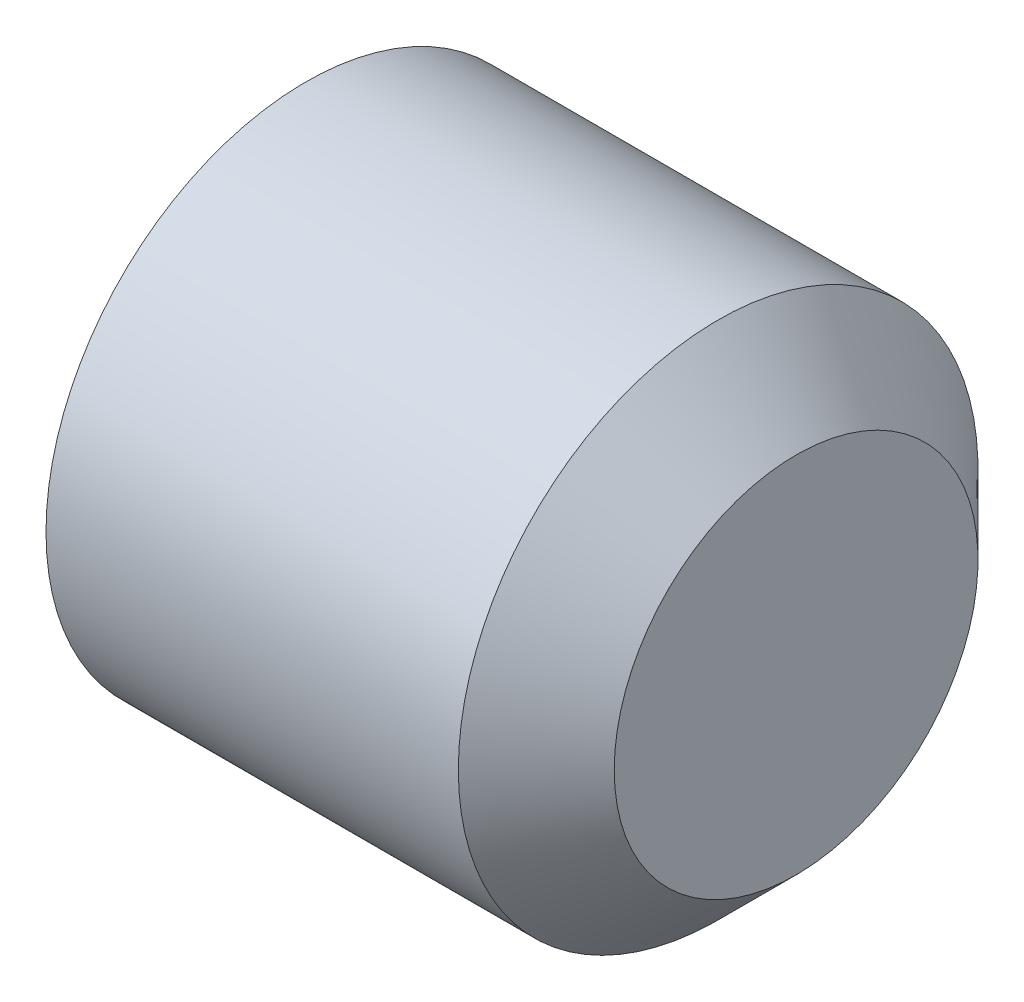
ISO-10303-21;
HEADER;
FILE_DESCRIPTION(('STEP AP214'),'2;1');
FILE_NAME('part.step','',(''),(''),'','','');
FILE_SCHEMA(('AUTOMOTIVE_DESIGN { 1 0 10303 214 1 1 1 1 }'));
ENDSEC;
DATA;
#1=APPLICATION_CONTEXT('core data for automotive mechanical design processes');
#2=APPLICATION_PROTOCOL_DEFINITION('international standard','automotive_design',2000,#1);
#3=PRODUCT_CONTEXT('',#1,'mechanical');
#4=PRODUCT('Part','Part','',(#3));
#5=PRODUCT_RELATED_PRODUCT_CATEGORY('part','',(#4));
#6=PRODUCT_DEFINITION_FORMATION('','',#4);
#7=PRODUCT_DEFINITION_CONTEXT('part definition',#1,'design');
#8=PRODUCT_DEFINITION('design','',#6,#7);
#9=PRODUCT_DEFINITION_SHAPE('','',#8);
#10=(LENGTH_UNIT() NAMED_UNIT(*) SI_UNIT(.MILLI.,.METRE.));
#11=(NAMED_UNIT(*) PLANE_ANGLE_UNIT() SI_UNIT($,.RADIAN.));
#12=(NAMED_UNIT(*) SI_UNIT($,.STERADIAN.) SOLID_ANGLE_UNIT());
#13=UNCERTAINTY_MEASURE_WITH_UNIT(LENGTH_MEASURE(1.E-05),#10,'distance_accuracy_value','');
#14=(GEOMETRIC_REPRESENTATION_CONTEXT(3) GLOBAL_UNCERTAINTY_ASSIGNED_CONTEXT((#13)) GLOBAL_UNIT_ASSIGNED_CONTEXT((#10,
#11,#12)) REPRESENTATION_CONTEXT('',''));
#15=CARTESIAN_POINT('',(0.,0.,0.));
#16=DIRECTION('',(0.,0.,1.));
#17=DIRECTION('',(1.,0.,0.));
#18=AXIS2_PLACEMENT_3D('',#15,#16,#17);
#19=CARTESIAN_POINT('',(-5.,2.01,0.));
#20=DIRECTION('',(1.,0.,0.));
#21=DIRECTION('',(0.,0.,-1.));
#22=AXIS2_PLACEMENT_3D('',#19,#20,#21);
#23=PLANE('',#22);
#24=CARTESIAN_POINT('',(-5.,0.,0.));
#25=DIRECTION('',(-1.,0.,0.));
#26=DIRECTION('',(0.,0.,1.));
#27=AXIS2_PLACEMENT_3D('',#24,#25,#26);
#28=CIRCLE('',#27,2.01);
#29=CARTESIAN_POINT('',(-5.,0.,2.01));
#30=VERTEX_POINT('',#29);
#31=EDGE_CURVE('E149',#30,#30,#28,.T.);
#32=ORIENTED_EDGE('',*,*,#31,.T.);
#33=EDGE_LOOP('',(#32));
#34=FACE_BOUND('',#33,.T.);
#35=DIRECTION('',(0.,0.5,-0.866025403784439));
#36=VECTOR('',#35,1.);
#37=CARTESIAN_POINT('',(-5.,-1.44337567297406,0.));
#38=LINE('',#37,#36);
#39=CARTESIAN_POINT('',(-5.,-1.44337567297406,0.));
#40=VERTEX_POINT('',#39);
#41=CARTESIAN_POINT('',(-5.,-0.721687836487033,-1.25));
#42=VERTEX_POINT('',#41);
#43=EDGE_CURVE('E58',#40,#42,#38,.T.);
#44=ORIENTED_EDGE('',*,*,#43,.T.);
#45=DIRECTION('',(0.,1.,0.));
#46=VECTOR('',#45,1.);
#47=CARTESIAN_POINT('',(-5.,-0.721687836487033,-1.25));
#48=LINE('',#47,#46);
#49=CARTESIAN_POINT('',(-5.,0.721687836487033,-1.25));
#50=VERTEX_POINT('',#49);
#51=EDGE_CURVE('E129',#42,#50,#48,.T.);
#52=ORIENTED_EDGE('',*,*,#51,.T.);
#53=DIRECTION('',(0.,0.5,0.866025403784439));
#54=VECTOR('',#53,1.);
#55=CARTESIAN_POINT('',(-5.,0.721687836487033,-1.25));
#56=LINE('',#55,#54);
#57=CARTESIAN_POINT('',(-5.,1.44337567297407,0.));
#58=VERTEX_POINT('',#57);
#59=EDGE_CURVE('E132',#50,#58,#56,.T.);
#60=ORIENTED_EDGE('',*,*,#59,.T.);
#61=DIRECTION('',(0.,-0.5,0.866025403784439));
#62=VECTOR('',#61,1.);
#63=CARTESIAN_POINT('',(-5.,1.44337567297407,0.));
#64=LINE('',#63,#62);
#65=CARTESIAN_POINT('',(-5.,0.721687836487033,1.25));
#66=VERTEX_POINT('',#65);
#67=EDGE_CURVE('E135',#58,#66,#64,.T.);
#68=ORIENTED_EDGE('',*,*,#67,.T.);
#69=DIRECTION('',(0.,-1.,0.));
#70=VECTOR('',#69,1.);
#71=CARTESIAN_POINT('',(-5.,0.721687836487033,1.25));
#72=LINE('',#71,#70);
#73=CARTESIAN_POINT('',(-5.,-0.721687836487032,1.25));
#74=VERTEX_POINT('',#73);
#75=EDGE_CURVE('E119',#66,#74,#72,.T.);
#76=ORIENTED_EDGE('',*,*,#75,.T.);
#77=DIRECTION('',(0.,-0.5,-0.866025403784439));
#78=VECTOR('',#77,1.);
#79=CARTESIAN_POINT('',(-5.,-0.721687836487032,1.25));
#80=LINE('',#79,#78);
#81=EDGE_CURVE('E138',#74,#40,#80,.T.);
#82=ORIENTED_EDGE('',*,*,#81,.T.);
#83=EDGE_LOOP('',(#44,#52,#60,#68,#76,#82));
#84=FACE_BOUND('',#83,.T.);
#85=ADVANCED_FACE('F43',(#34,#84),#23,.F.);
#86=CARTESIAN_POINT('',(0.,0.,0.));
#87=DIRECTION('',(-1.,0.,0.));
#88=DIRECTION('',(0.,0.,1.));
#89=AXIS2_PLACEMENT_3D('',#86,#87,#88);
#90=PLANE('',#89);
#91=CARTESIAN_POINT('',(0.,0.,0.));
#92=DIRECTION('',(-1.,0.,0.));
#93=DIRECTION('',(0.,0.,1.));
#94=AXIS2_PLACEMENT_3D('',#91,#92,#93);
#95=CIRCLE('',#94,1.75);
#96=CARTESIAN_POINT('',(0.,0.,1.75));
#97=VERTEX_POINT('',#96);
#98=EDGE_CURVE('E11',#97,#97,#95,.T.);
#99=ORIENTED_EDGE('',*,*,#98,.F.);
#100=EDGE_LOOP('',(#99));
#101=FACE_BOUND('',#100,.T.);
#102=ADVANCED_FACE('F45',(#101),#90,.F.);
#103=CARTESIAN_POINT('',(0.,0.,0.));
#104=DIRECTION('',(-1.,0.,0.));
#105=DIRECTION('',(0.,0.,1.));
#106=AXIS2_PLACEMENT_3D('',#103,#104,#105);
#107=CONICAL_SURFACE('',#106,1.75,0.785398163397443);
#108=CARTESIAN_POINT('',(-0.750000000000008,0.,0.));
#109=DIRECTION('',(-1.,0.,0.));
#110=DIRECTION('',(0.,0.,1.));
#111=AXIS2_PLACEMENT_3D('',#108,#109,#110);
#112=CIRCLE('',#111,2.5);
#113=CARTESIAN_POINT('',(-0.750000000000008,0.,2.5));
#114=VERTEX_POINT('',#113);
#115=EDGE_CURVE('E51',#114,#114,#112,.T.);
#116=ORIENTED_EDGE('',*,*,#115,.F.);
#117=EDGE_LOOP('',(#116));
#118=FACE_BOUND('',#117,.T.);
#119=ORIENTED_EDGE('',*,*,#98,.T.);
#120=EDGE_LOOP('',(#119));
#121=FACE_BOUND('',#120,.T.);
#122=ADVANCED_FACE('F159',(#118,#121),#107,.T.);
#123=CARTESIAN_POINT('',(-5.,0.,0.));
#124=DIRECTION('',(-1.,0.,0.));
#125=DIRECTION('',(0.,0.,1.));
#126=AXIS2_PLACEMENT_3D('',#123,#124,#125);
#127=CYLINDRICAL_SURFACE('',#126,2.5);
#128=CARTESIAN_POINT('',(-4.71709836809708,0.,0.));
#129=DIRECTION('',(-1.,0.,0.));
#130=DIRECTION('',(0.,0.,1.));
#131=AXIS2_PLACEMENT_3D('',#128,#129,#130);
#132=CIRCLE('',#131,2.5);
#133=CARTESIAN_POINT('',(-4.71709836809708,0.,2.5));
#134=VERTEX_POINT('',#133);
#135=EDGE_CURVE('E152',#134,#134,#132,.T.);
#136=ORIENTED_EDGE('',*,*,#135,.F.);
#137=EDGE_LOOP('',(#136));
#138=FACE_BOUND('',#137,.T.);
#139=ORIENTED_EDGE('',*,*,#115,.T.);
#140=EDGE_LOOP('',(#139));
#141=FACE_BOUND('',#140,.T.);
#142=ADVANCED_FACE('F157',(#138,#141),#127,.T.);
#143=CARTESIAN_POINT('',(-4.71709836809708,0.,0.));
#144=DIRECTION('',(1.,0.,0.));
#145=DIRECTION('',(0.,0.,-1.));
#146=AXIS2_PLACEMENT_3D('',#143,#144,#145);
#147=CONICAL_SURFACE('',#146,2.5,1.0471975511966);
#148=ORIENTED_EDGE('',*,*,#31,.F.);
#149=EDGE_LOOP('',(#148));
#150=FACE_BOUND('',#149,.T.);
#151=ORIENTED_EDGE('',*,*,#135,.T.);
#152=EDGE_LOOP('',(#151));
#153=FACE_BOUND('',#152,.T.);
#154=ADVANCED_FACE('F179',(#150,#153),#147,.T.);
#155=CARTESIAN_POINT('',(-3.,-1.44337567297406,0.));
#156=DIRECTION('',(0.,0.866025403784439,0.5));
#157=DIRECTION('',(0.,-0.5,0.866025403784439));
#158=AXIS2_PLACEMENT_3D('',#155,#156,#157);
#159=PLANE('',#158);
#160=ORIENTED_EDGE('',*,*,#43,.F.);
#161=DIRECTION('',(-1.,0.,0.));
#162=VECTOR('',#161,1.);
#163=CARTESIAN_POINT('',(-3.,-1.44337567297406,0.));
#164=LINE('',#163,#162);
#165=CARTESIAN_POINT('',(-3.,-1.44337567297406,0.));
#166=VERTEX_POINT('',#165);
#167=EDGE_CURVE('E124',#166,#40,#164,.T.);
#168=ORIENTED_EDGE('',*,*,#167,.F.);
#169=DIRECTION('',(0.,0.5,-0.866025403784439));
#170=VECTOR('',#169,1.);
#171=CARTESIAN_POINT('',(-3.,-1.44337567297406,0.));
#172=LINE('',#171,#170);
#173=CARTESIAN_POINT('',(-3.,-0.721687836487033,-1.25));
#174=VERTEX_POINT('',#173);
#175=EDGE_CURVE('E141',#166,#174,#172,.T.);
#176=ORIENTED_EDGE('',*,*,#175,.T.);
#177=DIRECTION('',(-1.,0.,0.));
#178=VECTOR('',#177,1.);
#179=CARTESIAN_POINT('',(-3.,-0.721687836487033,-1.25));
#180=LINE('',#179,#178);
#181=EDGE_CURVE('E147',#174,#42,#180,.T.);
#182=ORIENTED_EDGE('',*,*,#181,.T.);
#183=EDGE_LOOP('',(#160,#168,#176,#182));
#184=FACE_BOUND('',#183,.T.);
#185=ADVANCED_FACE('F177',(#184),#159,.T.);
#186=CARTESIAN_POINT('',(-3.,-0.721687836487033,-1.25));
#187=DIRECTION('',(0.,0.,1.));
#188=DIRECTION('',(1.,0.,0.));
#189=AXIS2_PLACEMENT_3D('',#186,#187,#188);
#190=PLANE('',#189);
#191=ORIENTED_EDGE('',*,*,#51,.F.);
#192=ORIENTED_EDGE('',*,*,#181,.F.);
#193=DIRECTION('',(0.,1.,0.));
#194=VECTOR('',#193,1.);
#195=CARTESIAN_POINT('',(-3.,-0.721687836487033,-1.25));
#196=LINE('',#195,#194);
#197=CARTESIAN_POINT('',(-3.,0.721687836487033,-1.25));
#198=VERTEX_POINT('',#197);
#199=EDGE_CURVE('E97',#174,#198,#196,.T.);
#200=ORIENTED_EDGE('',*,*,#199,.T.);
#201=DIRECTION('',(-1.,0.,0.));
#202=VECTOR('',#201,1.);
#203=CARTESIAN_POINT('',(-3.,0.721687836487033,-1.25));
#204=LINE('',#203,#202);
#205=EDGE_CURVE('E145',#198,#50,#204,.T.);
#206=ORIENTED_EDGE('',*,*,#205,.T.);
#207=EDGE_LOOP('',(#191,#192,#200,#206));
#208=FACE_BOUND('',#207,.T.);
#209=ADVANCED_FACE('F228',(#208),#190,.T.);
#210=CARTESIAN_POINT('',(-3.,0.721687836487033,-1.25));
#211=DIRECTION('',(0.,-0.866025403784439,0.5));
#212=DIRECTION('',(0.,-0.5,-0.866025403784439));
#213=AXIS2_PLACEMENT_3D('',#210,#211,#212);
#214=PLANE('',#213);
#215=ORIENTED_EDGE('',*,*,#59,.F.);
#216=ORIENTED_EDGE('',*,*,#205,.F.);
#217=DIRECTION('',(0.,0.5,0.866025403784439));
#218=VECTOR('',#217,1.);
#219=CARTESIAN_POINT('',(-3.,0.721687836487033,-1.25));
#220=LINE('',#219,#218);
#221=CARTESIAN_POINT('',(-3.,1.44337567297407,0.));
#222=VERTEX_POINT('',#221);
#223=EDGE_CURVE('E115',#198,#222,#220,.T.);
#224=ORIENTED_EDGE('',*,*,#223,.T.);
#225=DIRECTION('',(-1.,0.,0.));
#226=VECTOR('',#225,1.);
#227=CARTESIAN_POINT('',(-3.,1.44337567297407,0.));
#228=LINE('',#227,#226);
#229=EDGE_CURVE('E112',#222,#58,#228,.T.);
#230=ORIENTED_EDGE('',*,*,#229,.T.);
#231=EDGE_LOOP('',(#215,#216,#224,#230));
#232=FACE_BOUND('',#231,.T.);
#233=ADVANCED_FACE('F236',(#232),#214,.T.);
#234=CARTESIAN_POINT('',(-3.,1.44337567297407,0.));
#235=DIRECTION('',(0.,-0.866025403784439,-0.5));
#236=DIRECTION('',(0.,0.5,-0.866025403784439));
#237=AXIS2_PLACEMENT_3D('',#234,#235,#236);
#238=PLANE('',#237);
#239=ORIENTED_EDGE('',*,*,#67,.F.);
#240=ORIENTED_EDGE('',*,*,#229,.F.);
#241=DIRECTION('',(0.,-0.5,0.866025403784439));
#242=VECTOR('',#241,1.);
#243=CARTESIAN_POINT('',(-3.,1.44337567297407,0.));
#244=LINE('',#243,#242);
#245=CARTESIAN_POINT('',(-3.,0.721687836487033,1.25));
#246=VERTEX_POINT('',#245);
#247=EDGE_CURVE('E107',#222,#246,#244,.T.);
#248=ORIENTED_EDGE('',*,*,#247,.T.);
#249=DIRECTION('',(-1.,0.,0.));
#250=VECTOR('',#249,1.);
#251=CARTESIAN_POINT('',(-3.,0.721687836487033,1.25));
#252=LINE('',#251,#250);
#253=EDGE_CURVE('E111',#246,#66,#252,.T.);
#254=ORIENTED_EDGE('',*,*,#253,.T.);
#255=EDGE_LOOP('',(#239,#240,#248,#254));
#256=FACE_BOUND('',#255,.T.);
#257=ADVANCED_FACE('F110',(#256),#238,.T.);
#258=CARTESIAN_POINT('',(-3.,0.721687836487033,1.25));
#259=DIRECTION('',(0.,0.,-1.));
#260=DIRECTION('',(-1.,0.,0.));
#261=AXIS2_PLACEMENT_3D('',#258,#259,#260);
#262=PLANE('',#261);
#263=ORIENTED_EDGE('',*,*,#75,.F.);
#264=ORIENTED_EDGE('',*,*,#253,.F.);
#265=DIRECTION('',(0.,-1.,0.));
#266=VECTOR('',#265,1.);
#267=CARTESIAN_POINT('',(-3.,0.721687836487033,1.25));
#268=LINE('',#267,#266);
#269=CARTESIAN_POINT('',(-3.,-0.721687836487032,1.25));
#270=VERTEX_POINT('',#269);
#271=EDGE_CURVE('E114',#246,#270,#268,.T.);
#272=ORIENTED_EDGE('',*,*,#271,.T.);
#273=DIRECTION('',(-1.,0.,0.));
#274=VECTOR('',#273,1.);
#275=CARTESIAN_POINT('',(-3.,-0.721687836487032,1.25));
#276=LINE('',#275,#274);
#277=EDGE_CURVE('E88',#270,#74,#276,.T.);
#278=ORIENTED_EDGE('',*,*,#277,.T.);
#279=EDGE_LOOP('',(#263,#264,#272,#278));
#280=FACE_BOUND('',#279,.T.);
#281=ADVANCED_FACE('F117',(#280),#262,.T.);
#282=CARTESIAN_POINT('',(-3.,-0.721687836487032,1.25));
#283=DIRECTION('',(0.,0.866025403784439,-0.5));
#284=DIRECTION('',(0.,0.5,0.866025403784439));
#285=AXIS2_PLACEMENT_3D('',#282,#283,#284);
#286=PLANE('',#285);
#287=ORIENTED_EDGE('',*,*,#81,.F.);
#288=ORIENTED_EDGE('',*,*,#277,.F.);
#289=DIRECTION('',(0.,-0.5,-0.866025403784439));
#290=VECTOR('',#289,1.);
#291=CARTESIAN_POINT('',(-3.,-0.721687836487032,1.25));
#292=LINE('',#291,#290);
#293=EDGE_CURVE('E66',#270,#166,#292,.T.);
#294=ORIENTED_EDGE('',*,*,#293,.T.);
#295=ORIENTED_EDGE('',*,*,#167,.T.);
#296=EDGE_LOOP('',(#287,#288,#294,#295));
#297=FACE_BOUND('',#296,.T.);
#298=ADVANCED_FACE('F262',(#297),#286,.T.);
#299=CARTESIAN_POINT('',(-3.,0.,0.));
#300=DIRECTION('',(1.,0.,0.));
#301=DIRECTION('',(0.,0.,-1.));
#302=AXIS2_PLACEMENT_3D('',#299,#300,#301);
#303=PLANE('',#302);
#304=ORIENTED_EDGE('',*,*,#175,.F.);
#305=ORIENTED_EDGE('',*,*,#293,.F.);
#306=ORIENTED_EDGE('',*,*,#271,.F.);
#307=ORIENTED_EDGE('',*,*,#247,.F.);
#308=ORIENTED_EDGE('',*,*,#223,.F.);
#309=ORIENTED_EDGE('',*,*,#199,.F.);
#310=EDGE_LOOP('',(#304,#305,#306,#307,#308,#309));
#311=FACE_BOUND('',#310,.T.);
#312=ADVANCED_FACE('F122',(#311),#303,.F.);
#313=CLOSED_SHELL('',(#85,#102,#122,#142,#154,#185,#209,#233,#257,#281,#298,#312));
#314=MANIFOLD_SOLID_BREP('B2',#313);
#315=ADVANCED_BREP_SHAPE_REPRESENTATION('',(#18,#314),#14);
#316=SHAPE_DEFINITION_REPRESENTATION(#9,#315);
ENDSEC;
END-ISO-10303-21;
